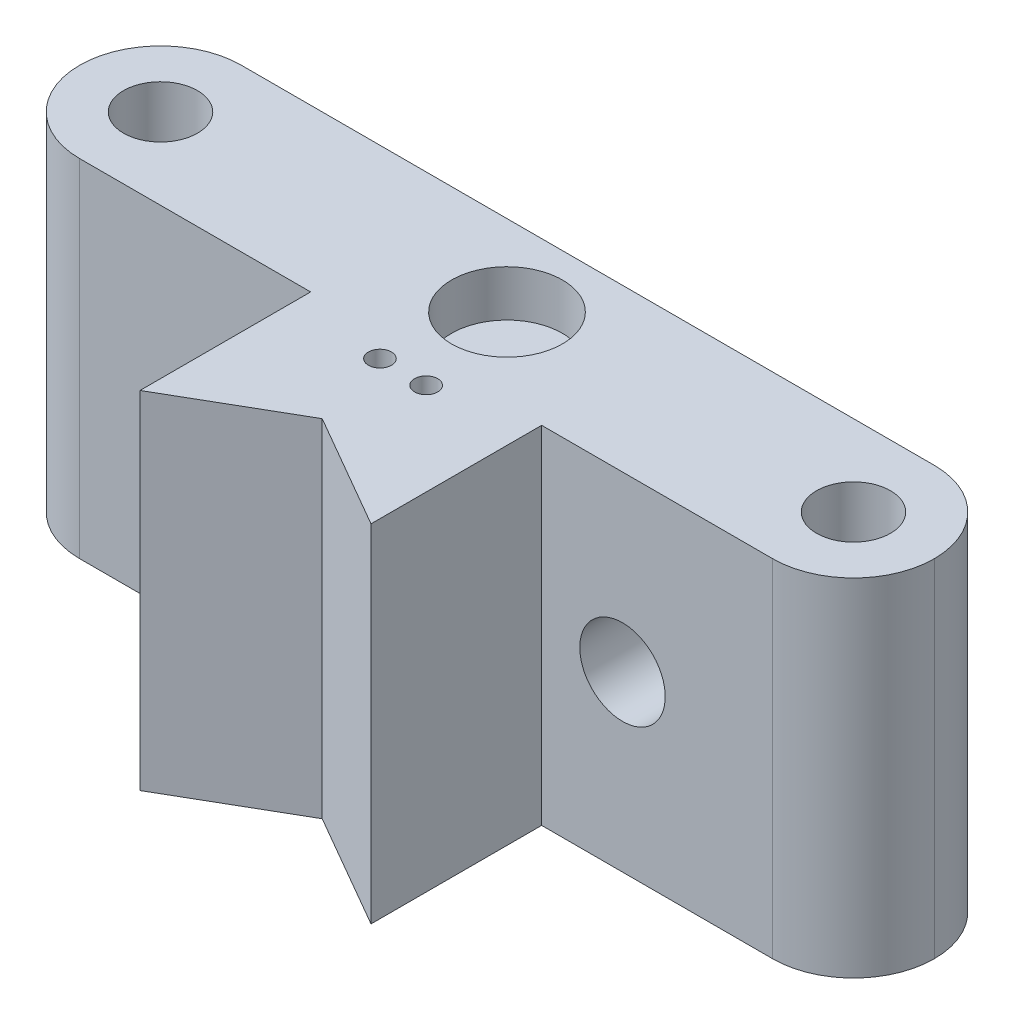
ISO-10303-21;
HEADER;
FILE_DESCRIPTION(('STEP AP214'),'2;1');
FILE_NAME('part.step','',(''),(''),'','','');
FILE_SCHEMA(('AUTOMOTIVE_DESIGN { 1 0 10303 214 1 1 1 1 }'));
ENDSEC;
DATA;
#1=APPLICATION_CONTEXT('core data for automotive mechanical design processes');
#2=APPLICATION_PROTOCOL_DEFINITION('international standard','automotive_design',2000,#1);
#3=PRODUCT_CONTEXT('',#1,'mechanical');
#4=PRODUCT('Part','Part','',(#3));
#5=PRODUCT_RELATED_PRODUCT_CATEGORY('part','',(#4));
#6=PRODUCT_DEFINITION_FORMATION('','',#4);
#7=PRODUCT_DEFINITION_CONTEXT('part definition',#1,'design');
#8=PRODUCT_DEFINITION('design','',#6,#7);
#9=PRODUCT_DEFINITION_SHAPE('','',#8);
#10=(LENGTH_UNIT() NAMED_UNIT(*) SI_UNIT(.MILLI.,.METRE.));
#11=(NAMED_UNIT(*) PLANE_ANGLE_UNIT() SI_UNIT($,.RADIAN.));
#12=(NAMED_UNIT(*) SI_UNIT($,.STERADIAN.) SOLID_ANGLE_UNIT());
#13=UNCERTAINTY_MEASURE_WITH_UNIT(LENGTH_MEASURE(1.E-05),#10,'distance_accuracy_value','');
#14=(GEOMETRIC_REPRESENTATION_CONTEXT(3) GLOBAL_UNCERTAINTY_ASSIGNED_CONTEXT((#13)) GLOBAL_UNIT_ASSIGNED_CONTEXT((#10,
#11,#12)) REPRESENTATION_CONTEXT('',''));
#15=CARTESIAN_POINT('',(0.,0.,0.));
#16=DIRECTION('',(0.,0.,1.));
#17=DIRECTION('',(1.,0.,0.));
#18=AXIS2_PLACEMENT_3D('',#15,#16,#17);
#19=CARTESIAN_POINT('',(0.,7.5,-3.5));
#20=DIRECTION('',(0.,0.,-1.));
#21=DIRECTION('',(-1.,0.,0.));
#22=AXIS2_PLACEMENT_3D('',#19,#20,#21);
#23=PLANE('',#22);
#24=CARTESIAN_POINT('',(8.5,0.,-3.5));
#25=DIRECTION('',(0.,0.,-1.));
#26=DIRECTION('',(-1.,0.,0.));
#27=AXIS2_PLACEMENT_3D('',#24,#25,#26);
#28=CIRCLE('',#27,1.85);
#29=CARTESIAN_POINT('',(6.65,0.,-3.5));
#30=VERTEX_POINT('',#29);
#31=EDGE_CURVE('E183',#30,#30,#28,.T.);
#32=ORIENTED_EDGE('',*,*,#31,.F.);
#33=EDGE_LOOP('',(#32));
#34=FACE_BOUND('',#33,.T.);
#35=CARTESIAN_POINT('',(-8.5,0.,-3.5));
#36=DIRECTION('',(0.,0.,-1.));
#37=DIRECTION('',(-1.,0.,0.));
#38=AXIS2_PLACEMENT_3D('',#35,#36,#37);
#39=CIRCLE('',#38,1.85);
#40=CARTESIAN_POINT('',(-10.35,0.,-3.5));
#41=VERTEX_POINT('',#40);
#42=EDGE_CURVE('E188',#41,#41,#39,.T.);
#43=ORIENTED_EDGE('',*,*,#42,.F.);
#44=EDGE_LOOP('',(#43));
#45=FACE_BOUND('',#44,.T.);
#46=DIRECTION('',(1.,0.,0.));
#47=VECTOR('',#46,1.);
#48=CARTESIAN_POINT('',(0.,-7.5,-3.5));
#49=LINE('',#48,#47);
#50=CARTESIAN_POINT('',(-15.,-7.5,-3.5));
#51=VERTEX_POINT('',#50);
#52=CARTESIAN_POINT('',(15.,-7.5,-3.5));
#53=VERTEX_POINT('',#52);
#54=EDGE_CURVE('E226',#51,#53,#49,.T.);
#55=ORIENTED_EDGE('',*,*,#54,.F.);
#56=DIRECTION('',(0.,-1.,0.));
#57=VECTOR('',#56,1.);
#58=CARTESIAN_POINT('',(-15.,7.5,-3.5));
#59=LINE('',#58,#57);
#60=CARTESIAN_POINT('',(-15.,7.5,-3.5));
#61=VERTEX_POINT('',#60);
#62=EDGE_CURVE('E45',#51,#61,#59,.F.);
#63=ORIENTED_EDGE('',*,*,#62,.T.);
#64=DIRECTION('',(1.,0.,0.));
#65=VECTOR('',#64,1.);
#66=CARTESIAN_POINT('',(0.,7.5,-3.5));
#67=LINE('',#66,#65);
#68=CARTESIAN_POINT('',(15.,7.5,-3.5));
#69=VERTEX_POINT('',#68);
#70=EDGE_CURVE('E134',#61,#69,#67,.T.);
#71=ORIENTED_EDGE('',*,*,#70,.T.);
#72=DIRECTION('',(0.,-1.,0.));
#73=VECTOR('',#72,1.);
#74=CARTESIAN_POINT('',(15.,7.5,-3.5));
#75=LINE('',#74,#73);
#76=EDGE_CURVE('E171',#69,#53,#75,.T.);
#77=ORIENTED_EDGE('',*,*,#76,.T.);
#78=EDGE_LOOP('',(#55,#63,#71,#77));
#79=FACE_BOUND('',#78,.T.);
#80=ADVANCED_FACE('F36',(#34,#45,#79),#23,.T.);
#81=CARTESIAN_POINT('',(0.,7.5,3.5));
#82=DIRECTION('',(0.,0.,-1.));
#83=DIRECTION('',(-1.,0.,0.));
#84=AXIS2_PLACEMENT_3D('',#81,#82,#83);
#85=PLANE('',#84);
#86=CARTESIAN_POINT('',(-8.5,0.,3.5));
#87=DIRECTION('',(0.,0.,-1.));
#88=DIRECTION('',(-1.,0.,0.));
#89=AXIS2_PLACEMENT_3D('',#86,#87,#88);
#90=CIRCLE('',#89,1.85);
#91=CARTESIAN_POINT('',(-10.35,0.,3.5));
#92=VERTEX_POINT('',#91);
#93=EDGE_CURVE('E40',#92,#92,#90,.T.);
#94=ORIENTED_EDGE('',*,*,#93,.T.);
#95=EDGE_LOOP('',(#94));
#96=FACE_BOUND('',#95,.T.);
#97=DIRECTION('',(1.,0.,0.));
#98=VECTOR('',#97,1.);
#99=CARTESIAN_POINT('',(0.,7.5,3.5));
#100=LINE('',#99,#98);
#101=CARTESIAN_POINT('',(-15.,7.5,3.5));
#102=VERTEX_POINT('',#101);
#103=CARTESIAN_POINT('',(-5.,7.5,3.5));
#104=VERTEX_POINT('',#103);
#105=EDGE_CURVE('E121',#102,#104,#100,.T.);
#106=ORIENTED_EDGE('',*,*,#105,.F.);
#107=DIRECTION('',(0.,-1.,0.));
#108=VECTOR('',#107,1.);
#109=CARTESIAN_POINT('',(-15.,7.5,3.5));
#110=LINE('',#109,#108);
#111=CARTESIAN_POINT('',(-15.,-7.5,3.5));
#112=VERTEX_POINT('',#111);
#113=EDGE_CURVE('E150',#102,#112,#110,.T.);
#114=ORIENTED_EDGE('',*,*,#113,.T.);
#115=DIRECTION('',(1.,0.,0.));
#116=VECTOR('',#115,1.);
#117=CARTESIAN_POINT('',(0.,-7.5,3.5));
#118=LINE('',#117,#116);
#119=CARTESIAN_POINT('',(-5.,-7.5,3.5));
#120=VERTEX_POINT('',#119);
#121=EDGE_CURVE('E148',#112,#120,#118,.T.);
#122=ORIENTED_EDGE('',*,*,#121,.T.);
#123=DIRECTION('',(0.,-1.,0.));
#124=VECTOR('',#123,1.);
#125=CARTESIAN_POINT('',(-5.,7.5,3.5));
#126=LINE('',#125,#124);
#127=EDGE_CURVE('E141',#104,#120,#126,.T.);
#128=ORIENTED_EDGE('',*,*,#127,.F.);
#129=EDGE_LOOP('',(#106,#114,#122,#128));
#130=FACE_BOUND('',#129,.T.);
#131=ADVANCED_FACE('F146',(#96,#130),#85,.F.);
#132=CARTESIAN_POINT('',(-5.,7.5,0.));
#133=DIRECTION('',(1.,0.,0.));
#134=DIRECTION('',(0.,0.,-1.));
#135=AXIS2_PLACEMENT_3D('',#132,#133,#134);
#136=PLANE('',#135);
#137=DIRECTION('',(0.,0.,1.));
#138=VECTOR('',#137,1.);
#139=CARTESIAN_POINT('',(-5.,-7.5,0.));
#140=LINE('',#139,#138);
#141=CARTESIAN_POINT('',(-5.,-7.5,10.8867513459481));
#142=VERTEX_POINT('',#141);
#143=EDGE_CURVE('E230',#120,#142,#140,.T.);
#144=ORIENTED_EDGE('',*,*,#143,.T.);
#145=DIRECTION('',(0.,-1.,0.));
#146=VECTOR('',#145,1.);
#147=CARTESIAN_POINT('',(-5.,7.5,10.8867513459481));
#148=LINE('',#147,#146);
#149=CARTESIAN_POINT('',(-5.,7.5,10.8867513459481));
#150=VERTEX_POINT('',#149);
#151=EDGE_CURVE('E143',#150,#142,#148,.T.);
#152=ORIENTED_EDGE('',*,*,#151,.F.);
#153=DIRECTION('',(0.,0.,1.));
#154=VECTOR('',#153,1.);
#155=CARTESIAN_POINT('',(-5.,7.5,0.));
#156=LINE('',#155,#154);
#157=EDGE_CURVE('E126',#104,#150,#156,.T.);
#158=ORIENTED_EDGE('',*,*,#157,.F.);
#159=ORIENTED_EDGE('',*,*,#127,.T.);
#160=EDGE_LOOP('',(#144,#152,#158,#159));
#161=FACE_BOUND('',#160,.T.);
#162=ADVANCED_FACE('F140',(#161),#136,.F.);
#163=CARTESIAN_POINT('',(3.46410161513776,7.5,5.99999999999999));
#164=DIRECTION('',(-0.500000000000001,0.,-0.866025403784438));
#165=DIRECTION('',(-0.866025403784438,0.,0.500000000000001));
#166=AXIS2_PLACEMENT_3D('',#163,#164,#165);
#167=PLANE('',#166);
#168=DIRECTION('',(0.866025403784438,0.,-0.500000000000001));
#169=VECTOR('',#168,1.);
#170=CARTESIAN_POINT('',(3.46410161513776,-7.5,5.99999999999999));
#171=LINE('',#170,#169);
#172=CARTESIAN_POINT('',(0.,-7.5,8.));
#173=VERTEX_POINT('',#172);
#174=EDGE_CURVE('E233',#142,#173,#171,.T.);
#175=ORIENTED_EDGE('',*,*,#174,.T.);
#176=DIRECTION('',(0.,-1.,0.));
#177=VECTOR('',#176,1.);
#178=CARTESIAN_POINT('',(0.,7.5,8.));
#179=LINE('',#178,#177);
#180=CARTESIAN_POINT('',(0.,7.5,8.));
#181=VERTEX_POINT('',#180);
#182=EDGE_CURVE('E154',#181,#173,#179,.T.);
#183=ORIENTED_EDGE('',*,*,#182,.F.);
#184=DIRECTION('',(0.866025403784438,0.,-0.500000000000001));
#185=VECTOR('',#184,1.);
#186=CARTESIAN_POINT('',(3.46410161513776,7.5,5.99999999999999));
#187=LINE('',#186,#185);
#188=EDGE_CURVE('E144',#150,#181,#187,.T.);
#189=ORIENTED_EDGE('',*,*,#188,.F.);
#190=ORIENTED_EDGE('',*,*,#151,.T.);
#191=EDGE_LOOP('',(#175,#183,#189,#190));
#192=FACE_BOUND('',#191,.T.);
#193=ADVANCED_FACE('F255',(#192),#167,.F.);
#194=CARTESIAN_POINT('',(-3.46410161513776,7.5,5.99999999999999));
#195=DIRECTION('',(0.500000000000001,0.,-0.866025403784438));
#196=DIRECTION('',(-0.866025403784438,0.,-0.500000000000001));
#197=AXIS2_PLACEMENT_3D('',#194,#195,#196);
#198=PLANE('',#197);
#199=DIRECTION('',(0.866025403784438,0.,0.500000000000001));
#200=VECTOR('',#199,1.);
#201=CARTESIAN_POINT('',(-3.46410161513776,-7.5,5.99999999999999));
#202=LINE('',#201,#200);
#203=CARTESIAN_POINT('',(5.,-7.5,10.8867513459481));
#204=VERTEX_POINT('',#203);
#205=EDGE_CURVE('E236',#173,#204,#202,.T.);
#206=ORIENTED_EDGE('',*,*,#205,.T.);
#207=DIRECTION('',(0.,-1.,0.));
#208=VECTOR('',#207,1.);
#209=CARTESIAN_POINT('',(5.,7.5,10.8867513459481));
#210=LINE('',#209,#208);
#211=CARTESIAN_POINT('',(5.,7.5,10.8867513459481));
#212=VERTEX_POINT('',#211);
#213=EDGE_CURVE('E248',#212,#204,#210,.T.);
#214=ORIENTED_EDGE('',*,*,#213,.F.);
#215=DIRECTION('',(0.866025403784438,0.,0.500000000000001));
#216=VECTOR('',#215,1.);
#217=CARTESIAN_POINT('',(-3.46410161513776,7.5,5.99999999999999));
#218=LINE('',#217,#216);
#219=EDGE_CURVE('E209',#181,#212,#218,.T.);
#220=ORIENTED_EDGE('',*,*,#219,.F.);
#221=ORIENTED_EDGE('',*,*,#182,.T.);
#222=EDGE_LOOP('',(#206,#214,#220,#221));
#223=FACE_BOUND('',#222,.T.);
#224=ADVANCED_FACE('F252',(#223),#198,.F.);
#225=CARTESIAN_POINT('',(5.,7.5,0.));
#226=DIRECTION('',(1.,0.,0.));
#227=DIRECTION('',(0.,0.,-1.));
#228=AXIS2_PLACEMENT_3D('',#225,#226,#227);
#229=PLANE('',#228);
#230=DIRECTION('',(0.,0.,1.));
#231=VECTOR('',#230,1.);
#232=CARTESIAN_POINT('',(5.,-7.5,0.));
#233=LINE('',#232,#231);
#234=CARTESIAN_POINT('',(5.,-7.5,3.5));
#235=VERTEX_POINT('',#234);
#236=EDGE_CURVE('E239',#235,#204,#233,.T.);
#237=ORIENTED_EDGE('',*,*,#236,.F.);
#238=DIRECTION('',(0.,-1.,0.));
#239=VECTOR('',#238,1.);
#240=CARTESIAN_POINT('',(5.,7.5,3.5));
#241=LINE('',#240,#239);
#242=CARTESIAN_POINT('',(5.,7.5,3.5));
#243=VERTEX_POINT('',#242);
#244=EDGE_CURVE('E220',#243,#235,#241,.T.);
#245=ORIENTED_EDGE('',*,*,#244,.F.);
#246=DIRECTION('',(0.,0.,1.));
#247=VECTOR('',#246,1.);
#248=CARTESIAN_POINT('',(5.,7.5,0.));
#249=LINE('',#248,#247);
#250=EDGE_CURVE('E211',#243,#212,#249,.T.);
#251=ORIENTED_EDGE('',*,*,#250,.T.);
#252=ORIENTED_EDGE('',*,*,#213,.T.);
#253=EDGE_LOOP('',(#237,#245,#251,#252));
#254=FACE_BOUND('',#253,.T.);
#255=ADVANCED_FACE('F262',(#254),#229,.T.);
#256=CARTESIAN_POINT('',(1.,7.5,4.5));
#257=DIRECTION('',(0.,-1.,0.));
#258=DIRECTION('',(0.,0.,-1.));
#259=AXIS2_PLACEMENT_3D('',#256,#257,#258);
#260=CYLINDRICAL_SURFACE('',#259,0.5);
#261=CARTESIAN_POINT('',(1.,7.5,4.5));
#262=DIRECTION('',(0.,1.,0.));
#263=DIRECTION('',(0.,0.,1.));
#264=AXIS2_PLACEMENT_3D('',#261,#262,#263);
#265=CIRCLE('',#264,0.5);
#266=CARTESIAN_POINT('',(1.,7.5,5.));
#267=VERTEX_POINT('',#266);
#268=EDGE_CURVE('E214',#267,#267,#265,.T.);
#269=ORIENTED_EDGE('',*,*,#268,.T.);
#270=EDGE_LOOP('',(#269));
#271=FACE_BOUND('',#270,.T.);
#272=CARTESIAN_POINT('',(1.,-7.5,4.5));
#273=DIRECTION('',(0.,1.,0.));
#274=DIRECTION('',(0.,0.,1.));
#275=AXIS2_PLACEMENT_3D('',#272,#273,#274);
#276=CIRCLE('',#275,0.5);
#277=CARTESIAN_POINT('',(1.,-7.5,5.));
#278=VERTEX_POINT('',#277);
#279=EDGE_CURVE('E242',#278,#278,#276,.T.);
#280=ORIENTED_EDGE('',*,*,#279,.F.);
#281=EDGE_LOOP('',(#280));
#282=FACE_BOUND('',#281,.T.);
#283=ADVANCED_FACE('F283',(#271,#282),#260,.F.);
#284=CARTESIAN_POINT('',(8.5,0.,3.5));
#285=DIRECTION('',(0.,0.,-1.));
#286=DIRECTION('',(-1.,0.,0.));
#287=AXIS2_PLACEMENT_3D('',#284,#285,#286);
#288=CIRCLE('',#287,1.85);
#289=CARTESIAN_POINT('',(6.65,0.,3.5));
#290=VERTEX_POINT('',#289);
#291=EDGE_CURVE('E181',#290,#290,#288,.T.);
#292=ORIENTED_EDGE('',*,*,#291,.T.);
#293=EDGE_LOOP('',(#292));
#294=FACE_BOUND('',#293,.T.);
#295=CARTESIAN_POINT('',(15.,-7.5,3.5));
#296=VERTEX_POINT('',#295);
#297=EDGE_CURVE('E231',#235,#296,#118,.T.);
#298=ORIENTED_EDGE('',*,*,#297,.T.);
#299=DIRECTION('',(0.,-1.,0.));
#300=VECTOR('',#299,1.);
#301=CARTESIAN_POINT('',(15.,7.5,3.5));
#302=LINE('',#301,#300);
#303=CARTESIAN_POINT('',(15.,7.5,3.5));
#304=VERTEX_POINT('',#303);
#305=EDGE_CURVE('E11',#296,#304,#302,.F.);
#306=ORIENTED_EDGE('',*,*,#305,.T.);
#307=EDGE_CURVE('E136',#243,#304,#100,.T.);
#308=ORIENTED_EDGE('',*,*,#307,.F.);
#309=ORIENTED_EDGE('',*,*,#244,.T.);
#310=EDGE_LOOP('',(#298,#306,#308,#309));
#311=FACE_BOUND('',#310,.T.);
#312=ADVANCED_FACE('F280',(#294,#311),#85,.F.);
#313=CARTESIAN_POINT('',(-15.,7.5,0.));
#314=DIRECTION('',(0.,-1.,0.));
#315=DIRECTION('',(0.,0.,-1.));
#316=AXIS2_PLACEMENT_3D('',#313,#314,#315);
#317=CYLINDRICAL_SURFACE('',#316,1.6);
#318=CARTESIAN_POINT('',(-15.,7.5,0.));
#319=DIRECTION('',(0.,1.,0.));
#320=DIRECTION('',(0.,0.,1.));
#321=AXIS2_PLACEMENT_3D('',#318,#319,#320);
#322=CIRCLE('',#321,1.6);
#323=CARTESIAN_POINT('',(-15.,7.5,1.6));
#324=VERTEX_POINT('',#323);
#325=EDGE_CURVE('E202',#324,#324,#322,.T.);
#326=ORIENTED_EDGE('',*,*,#325,.T.);
#327=EDGE_LOOP('',(#326));
#328=FACE_BOUND('',#327,.T.);
#329=CARTESIAN_POINT('',(-15.,-7.5,0.));
#330=DIRECTION('',(0.,1.,0.));
#331=DIRECTION('',(0.,0.,1.));
#332=AXIS2_PLACEMENT_3D('',#329,#330,#331);
#333=CIRCLE('',#332,1.6);
#334=CARTESIAN_POINT('',(-15.,-7.5,1.6));
#335=VERTEX_POINT('',#334);
#336=EDGE_CURVE('E223',#335,#335,#333,.T.);
#337=ORIENTED_EDGE('',*,*,#336,.F.);
#338=EDGE_LOOP('',(#337));
#339=FACE_BOUND('',#338,.T.);
#340=ADVANCED_FACE('F282',(#328,#339),#317,.F.);
#341=CARTESIAN_POINT('',(15.,7.5,0.));
#342=DIRECTION('',(0.,-1.,0.));
#343=DIRECTION('',(0.,0.,-1.));
#344=AXIS2_PLACEMENT_3D('',#341,#342,#343);
#345=CYLINDRICAL_SURFACE('',#344,1.6);
#346=CARTESIAN_POINT('',(15.,7.5,0.));
#347=DIRECTION('',(0.,1.,0.));
#348=DIRECTION('',(0.,0.,1.));
#349=AXIS2_PLACEMENT_3D('',#346,#347,#348);
#350=CIRCLE('',#349,1.6);
#351=CARTESIAN_POINT('',(15.,7.5,1.6));
#352=VERTEX_POINT('',#351);
#353=EDGE_CURVE('E199',#352,#352,#350,.T.);
#354=ORIENTED_EDGE('',*,*,#353,.T.);
#355=EDGE_LOOP('',(#354));
#356=FACE_BOUND('',#355,.T.);
#357=CARTESIAN_POINT('',(15.,-7.5,0.));
#358=DIRECTION('',(0.,1.,0.));
#359=DIRECTION('',(0.,0.,1.));
#360=AXIS2_PLACEMENT_3D('',#357,#358,#359);
#361=CIRCLE('',#360,1.6);
#362=CARTESIAN_POINT('',(15.,-7.5,1.6));
#363=VERTEX_POINT('',#362);
#364=EDGE_CURVE('E178',#363,#363,#361,.T.);
#365=ORIENTED_EDGE('',*,*,#364,.F.);
#366=EDGE_LOOP('',(#365));
#367=FACE_BOUND('',#366,.T.);
#368=ADVANCED_FACE('F289',(#356,#367),#345,.F.);
#369=CARTESIAN_POINT('',(-1.,7.5,4.5));
#370=DIRECTION('',(0.,-1.,0.));
#371=DIRECTION('',(0.,0.,-1.));
#372=AXIS2_PLACEMENT_3D('',#369,#370,#371);
#373=CYLINDRICAL_SURFACE('',#372,0.5);
#374=CARTESIAN_POINT('',(-1.,7.5,4.5));
#375=DIRECTION('',(0.,1.,0.));
#376=DIRECTION('',(0.,0.,1.));
#377=AXIS2_PLACEMENT_3D('',#374,#375,#376);
#378=CIRCLE('',#377,0.5);
#379=CARTESIAN_POINT('',(-1.,7.5,5.));
#380=VERTEX_POINT('',#379);
#381=EDGE_CURVE('E217',#380,#380,#378,.T.);
#382=ORIENTED_EDGE('',*,*,#381,.T.);
#383=EDGE_LOOP('',(#382));
#384=FACE_BOUND('',#383,.T.);
#385=CARTESIAN_POINT('',(-1.,-7.5,4.5));
#386=DIRECTION('',(0.,1.,0.));
#387=DIRECTION('',(0.,0.,1.));
#388=AXIS2_PLACEMENT_3D('',#385,#386,#387);
#389=CIRCLE('',#388,0.5);
#390=CARTESIAN_POINT('',(-1.,-7.5,5.));
#391=VERTEX_POINT('',#390);
#392=EDGE_CURVE('E203',#391,#391,#389,.T.);
#393=ORIENTED_EDGE('',*,*,#392,.F.);
#394=EDGE_LOOP('',(#393));
#395=FACE_BOUND('',#394,.T.);
#396=ADVANCED_FACE('F308',(#384,#395),#373,.F.);
#397=CARTESIAN_POINT('',(0.,7.5,0.));
#398=DIRECTION('',(0.,1.,0.));
#399=DIRECTION('',(0.,0.,1.));
#400=AXIS2_PLACEMENT_3D('',#397,#398,#399);
#401=PLANE('',#400);
#402=CARTESIAN_POINT('',(0.,7.5,0.));
#403=DIRECTION('',(0.,1.,0.));
#404=DIRECTION('',(0.,0.,1.));
#405=AXIS2_PLACEMENT_3D('',#402,#403,#404);
#406=CIRCLE('',#405,2.4);
#407=CARTESIAN_POINT('',(0.,7.5,2.4));
#408=VERTEX_POINT('',#407);
#409=EDGE_CURVE('E196',#408,#408,#406,.T.);
#410=ORIENTED_EDGE('',*,*,#409,.F.);
#411=EDGE_LOOP('',(#410));
#412=FACE_BOUND('',#411,.T.);
#413=ORIENTED_EDGE('',*,*,#353,.F.);
#414=EDGE_LOOP('',(#413));
#415=FACE_BOUND('',#414,.T.);
#416=ORIENTED_EDGE('',*,*,#325,.F.);
#417=EDGE_LOOP('',(#416));
#418=FACE_BOUND('',#417,.T.);
#419=CARTESIAN_POINT('',(-15.,7.5,0.));
#420=DIRECTION('',(0.,1.,0.));
#421=DIRECTION('',(0.,0.,1.));
#422=AXIS2_PLACEMENT_3D('',#419,#420,#421);
#423=CIRCLE('',#422,3.5);
#424=CARTESIAN_POINT('',(-18.5,7.5,0.));
#425=VERTEX_POINT('',#424);
#426=EDGE_CURVE('E59',#61,#425,#423,.T.);
#427=ORIENTED_EDGE('',*,*,#426,.T.);
#428=CARTESIAN_POINT('',(-15.,7.5,0.));
#429=DIRECTION('',(0.,1.,0.));
#430=DIRECTION('',(0.,0.,1.));
#431=AXIS2_PLACEMENT_3D('',#428,#429,#430);
#432=CIRCLE('',#431,3.5);
#433=EDGE_CURVE('E129',#425,#102,#432,.T.);
#434=ORIENTED_EDGE('',*,*,#433,.T.);
#435=ORIENTED_EDGE('',*,*,#105,.T.);
#436=ORIENTED_EDGE('',*,*,#157,.T.);
#437=ORIENTED_EDGE('',*,*,#188,.T.);
#438=ORIENTED_EDGE('',*,*,#219,.T.);
#439=ORIENTED_EDGE('',*,*,#250,.F.);
#440=ORIENTED_EDGE('',*,*,#307,.T.);
#441=CARTESIAN_POINT('',(15.,7.5,0.));
#442=DIRECTION('',(0.,1.,0.));
#443=DIRECTION('',(0.,0.,1.));
#444=AXIS2_PLACEMENT_3D('',#441,#442,#443);
#445=CIRCLE('',#444,3.5);
#446=CARTESIAN_POINT('',(18.5,7.5,0.));
#447=VERTEX_POINT('',#446);
#448=EDGE_CURVE('E165',#304,#447,#445,.T.);
#449=ORIENTED_EDGE('',*,*,#448,.T.);
#450=CARTESIAN_POINT('',(15.,7.5,0.));
#451=DIRECTION('',(0.,1.,0.));
#452=DIRECTION('',(0.,0.,1.));
#453=AXIS2_PLACEMENT_3D('',#450,#451,#452);
#454=CIRCLE('',#453,3.5);
#455=EDGE_CURVE('E167',#447,#69,#454,.T.);
#456=ORIENTED_EDGE('',*,*,#455,.T.);
#457=ORIENTED_EDGE('',*,*,#70,.F.);
#458=EDGE_LOOP('',(#427,#434,#435,#436,#437,#438,#439,#440,#449,#456,#457));
#459=FACE_BOUND('',#458,.T.);
#460=ORIENTED_EDGE('',*,*,#268,.F.);
#461=EDGE_LOOP('',(#460));
#462=FACE_BOUND('',#461,.T.);
#463=ORIENTED_EDGE('',*,*,#381,.F.);
#464=EDGE_LOOP('',(#463));
#465=FACE_BOUND('',#464,.T.);
#466=ADVANCED_FACE('F123',(#412,#415,#418,#459,#462,#465),#401,.T.);
#467=CARTESIAN_POINT('',(0.,-7.5,0.));
#468=DIRECTION('',(0.,1.,0.));
#469=DIRECTION('',(0.,0.,1.));
#470=AXIS2_PLACEMENT_3D('',#467,#468,#469);
#471=PLANE('',#470);
#472=ORIENTED_EDGE('',*,*,#364,.T.);
#473=EDGE_LOOP('',(#472));
#474=FACE_BOUND('',#473,.T.);
#475=ORIENTED_EDGE('',*,*,#336,.T.);
#476=EDGE_LOOP('',(#475));
#477=FACE_BOUND('',#476,.T.);
#478=ORIENTED_EDGE('',*,*,#121,.F.);
#479=CARTESIAN_POINT('',(-15.,-7.5,0.));
#480=DIRECTION('',(0.,1.,0.));
#481=DIRECTION('',(0.,0.,1.));
#482=AXIS2_PLACEMENT_3D('',#479,#480,#481);
#483=CIRCLE('',#482,3.5);
#484=CARTESIAN_POINT('',(-18.5,-7.5,0.));
#485=VERTEX_POINT('',#484);
#486=EDGE_CURVE('E163',#112,#485,#483,.F.);
#487=ORIENTED_EDGE('',*,*,#486,.T.);
#488=CARTESIAN_POINT('',(-15.,-7.5,0.));
#489=DIRECTION('',(0.,1.,0.));
#490=DIRECTION('',(0.,0.,1.));
#491=AXIS2_PLACEMENT_3D('',#488,#489,#490);
#492=CIRCLE('',#491,3.5);
#493=EDGE_CURVE('E161',#485,#51,#492,.F.);
#494=ORIENTED_EDGE('',*,*,#493,.T.);
#495=ORIENTED_EDGE('',*,*,#54,.T.);
#496=CARTESIAN_POINT('',(15.,-7.5,0.));
#497=DIRECTION('',(0.,1.,0.));
#498=DIRECTION('',(0.,0.,1.));
#499=AXIS2_PLACEMENT_3D('',#496,#497,#498);
#500=CIRCLE('',#499,3.5);
#501=CARTESIAN_POINT('',(18.5,-7.5,0.));
#502=VERTEX_POINT('',#501);
#503=EDGE_CURVE('E159',#53,#502,#500,.F.);
#504=ORIENTED_EDGE('',*,*,#503,.T.);
#505=CARTESIAN_POINT('',(15.,-7.5,0.));
#506=DIRECTION('',(0.,1.,0.));
#507=DIRECTION('',(0.,0.,1.));
#508=AXIS2_PLACEMENT_3D('',#505,#506,#507);
#509=CIRCLE('',#508,3.5);
#510=EDGE_CURVE('E152',#502,#296,#509,.F.);
#511=ORIENTED_EDGE('',*,*,#510,.T.);
#512=ORIENTED_EDGE('',*,*,#297,.F.);
#513=ORIENTED_EDGE('',*,*,#236,.T.);
#514=ORIENTED_EDGE('',*,*,#205,.F.);
#515=ORIENTED_EDGE('',*,*,#174,.F.);
#516=ORIENTED_EDGE('',*,*,#143,.F.);
#517=EDGE_LOOP('',(#478,#487,#494,#495,#504,#511,#512,#513,#514,#515,#516));
#518=FACE_BOUND('',#517,.T.);
#519=ORIENTED_EDGE('',*,*,#279,.T.);
#520=EDGE_LOOP('',(#519));
#521=FACE_BOUND('',#520,.T.);
#522=ORIENTED_EDGE('',*,*,#392,.T.);
#523=EDGE_LOOP('',(#522));
#524=FACE_BOUND('',#523,.T.);
#525=ADVANCED_FACE('F257',(#474,#477,#518,#521,#524),#471,.F.);
#526=CARTESIAN_POINT('',(-15.,7.5,0.));
#527=DIRECTION('',(0.,1.,0.));
#528=DIRECTION('',(0.,0.,1.));
#529=AXIS2_PLACEMENT_3D('',#526,#527,#528);
#530=CYLINDRICAL_SURFACE('',#529,3.5);
#531=DIRECTION('',(0.,-1.,0.));
#532=VECTOR('',#531,1.);
#533=CARTESIAN_POINT('',(-18.5,-7.5,0.));
#534=LINE('',#533,#532);
#535=EDGE_CURVE('E175',#425,#485,#534,.T.);
#536=ORIENTED_EDGE('',*,*,#535,.F.);
#537=ORIENTED_EDGE('',*,*,#426,.F.);
#538=ORIENTED_EDGE('',*,*,#62,.F.);
#539=ORIENTED_EDGE('',*,*,#493,.F.);
#540=EDGE_LOOP('',(#536,#537,#538,#539));
#541=FACE_BOUND('',#540,.T.);
#542=ADVANCED_FACE('F277',(#541),#530,.T.);
#543=CARTESIAN_POINT('',(-15.,7.5,0.));
#544=DIRECTION('',(0.,-1.,0.));
#545=DIRECTION('',(0.,0.,-1.));
#546=AXIS2_PLACEMENT_3D('',#543,#544,#545);
#547=CYLINDRICAL_SURFACE('',#546,3.5);
#548=ORIENTED_EDGE('',*,*,#433,.F.);
#549=ORIENTED_EDGE('',*,*,#535,.T.);
#550=ORIENTED_EDGE('',*,*,#486,.F.);
#551=ORIENTED_EDGE('',*,*,#113,.F.);
#552=EDGE_LOOP('',(#548,#549,#550,#551));
#553=FACE_BOUND('',#552,.T.);
#554=ADVANCED_FACE('F279',(#553),#547,.T.);
#555=CARTESIAN_POINT('',(15.,7.5,0.));
#556=DIRECTION('',(0.,1.,0.));
#557=DIRECTION('',(0.,0.,1.));
#558=AXIS2_PLACEMENT_3D('',#555,#556,#557);
#559=CYLINDRICAL_SURFACE('',#558,3.5);
#560=DIRECTION('',(0.,-1.,0.));
#561=VECTOR('',#560,1.);
#562=CARTESIAN_POINT('',(18.5,-7.5,0.));
#563=LINE('',#562,#561);
#564=EDGE_CURVE('E179',#447,#502,#563,.T.);
#565=ORIENTED_EDGE('',*,*,#564,.F.);
#566=ORIENTED_EDGE('',*,*,#448,.F.);
#567=ORIENTED_EDGE('',*,*,#305,.F.);
#568=ORIENTED_EDGE('',*,*,#510,.F.);
#569=EDGE_LOOP('',(#565,#566,#567,#568));
#570=FACE_BOUND('',#569,.T.);
#571=ADVANCED_FACE('F38',(#570),#559,.T.);
#572=CARTESIAN_POINT('',(15.,7.5,0.));
#573=DIRECTION('',(0.,-1.,0.));
#574=DIRECTION('',(0.,0.,-1.));
#575=AXIS2_PLACEMENT_3D('',#572,#573,#574);
#576=CYLINDRICAL_SURFACE('',#575,3.5);
#577=ORIENTED_EDGE('',*,*,#455,.F.);
#578=ORIENTED_EDGE('',*,*,#564,.T.);
#579=ORIENTED_EDGE('',*,*,#503,.F.);
#580=ORIENTED_EDGE('',*,*,#76,.F.);
#581=EDGE_LOOP('',(#577,#578,#579,#580));
#582=FACE_BOUND('',#581,.T.);
#583=ADVANCED_FACE('F271',(#582),#576,.T.);
#584=CARTESIAN_POINT('',(8.5,0.,10.8867513459481));
#585=DIRECTION('',(0.,0.,-1.));
#586=DIRECTION('',(-1.,0.,0.));
#587=AXIS2_PLACEMENT_3D('',#584,#585,#586);
#588=CYLINDRICAL_SURFACE('',#587,1.85);
#589=ORIENTED_EDGE('',*,*,#31,.T.);
#590=EDGE_LOOP('',(#589));
#591=FACE_BOUND('',#590,.T.);
#592=ORIENTED_EDGE('',*,*,#291,.F.);
#593=EDGE_LOOP('',(#592));
#594=FACE_BOUND('',#593,.T.);
#595=ADVANCED_FACE('F314',(#591,#594),#588,.F.);
#596=CARTESIAN_POINT('',(-8.5,0.,10.8867513459481));
#597=DIRECTION('',(0.,0.,-1.));
#598=DIRECTION('',(-1.,0.,0.));
#599=AXIS2_PLACEMENT_3D('',#596,#597,#598);
#600=CYLINDRICAL_SURFACE('',#599,1.85);
#601=ORIENTED_EDGE('',*,*,#42,.T.);
#602=EDGE_LOOP('',(#601));
#603=FACE_BOUND('',#602,.T.);
#604=ORIENTED_EDGE('',*,*,#93,.F.);
#605=EDGE_LOOP('',(#604));
#606=FACE_BOUND('',#605,.T.);
#607=ADVANCED_FACE('F319',(#603,#606),#600,.F.);
#608=CARTESIAN_POINT('',(0.,5.5,0.));
#609=DIRECTION('',(0.,1.,0.));
#610=DIRECTION('',(0.,0.,1.));
#611=AXIS2_PLACEMENT_3D('',#608,#609,#610);
#612=CYLINDRICAL_SURFACE('',#611,2.4);
#613=CARTESIAN_POINT('',(0.,5.5,0.));
#614=DIRECTION('',(0.,1.,0.));
#615=DIRECTION('',(0.,0.,1.));
#616=AXIS2_PLACEMENT_3D('',#613,#614,#615);
#617=CIRCLE('',#616,2.4);
#618=CARTESIAN_POINT('',(0.,5.5,2.4));
#619=VERTEX_POINT('',#618);
#620=EDGE_CURVE('E193',#619,#619,#617,.T.);
#621=ORIENTED_EDGE('',*,*,#620,.F.);
#622=EDGE_LOOP('',(#621));
#623=FACE_BOUND('',#622,.T.);
#624=ORIENTED_EDGE('',*,*,#409,.T.);
#625=EDGE_LOOP('',(#624));
#626=FACE_BOUND('',#625,.T.);
#627=ADVANCED_FACE('F425',(#623,#626),#612,.F.);
#628=CARTESIAN_POINT('',(0.,5.5,0.));
#629=DIRECTION('',(0.,1.,0.));
#630=DIRECTION('',(0.,0.,1.));
#631=AXIS2_PLACEMENT_3D('',#628,#629,#630);
#632=PLANE('',#631);
#633=ORIENTED_EDGE('',*,*,#620,.T.);
#634=EDGE_LOOP('',(#633));
#635=FACE_BOUND('',#634,.T.);
#636=ADVANCED_FACE('F435',(#635),#632,.T.);
#637=CLOSED_SHELL('',(#80,#131,#162,#193,#224,#255,#283,#312,#340,#368,#396,#466,#525,#542,#554,
#571,#583,#595,#607,#627,#636));
#638=MANIFOLD_SOLID_BREP('B2',#637);
#639=ADVANCED_BREP_SHAPE_REPRESENTATION('',(#18,#638),#14);
#640=SHAPE_DEFINITION_REPRESENTATION(#9,#639);
ENDSEC;
END-ISO-10303-21;
